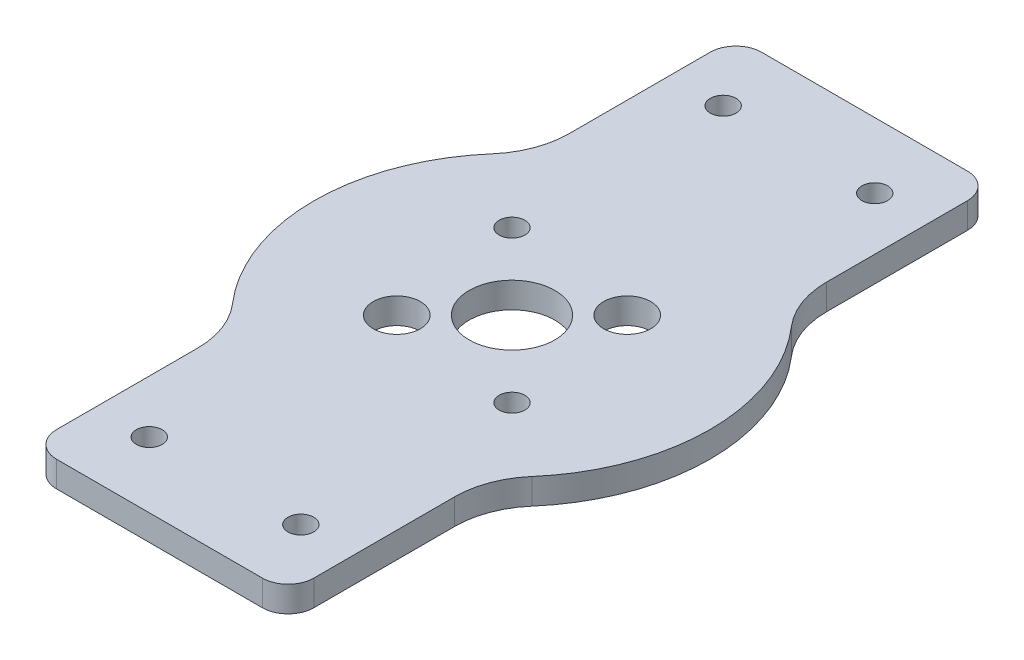
ISO-10303-21;
HEADER;
FILE_DESCRIPTION(('STEP AP214'),'2;1');
FILE_NAME('part.step','',(''),(''),'','','');
FILE_SCHEMA(('AUTOMOTIVE_DESIGN { 1 0 10303 214 1 1 1 1 }'));
ENDSEC;
DATA;
#1=APPLICATION_CONTEXT('core data for automotive mechanical design processes');
#2=APPLICATION_PROTOCOL_DEFINITION('international standard','automotive_design',2000,#1);
#3=PRODUCT_CONTEXT('',#1,'mechanical');
#4=PRODUCT('Part','Part','',(#3));
#5=PRODUCT_RELATED_PRODUCT_CATEGORY('part','',(#4));
#6=PRODUCT_DEFINITION_FORMATION('','',#4);
#7=PRODUCT_DEFINITION_CONTEXT('part definition',#1,'design');
#8=PRODUCT_DEFINITION('design','',#6,#7);
#9=PRODUCT_DEFINITION_SHAPE('','',#8);
#10=(LENGTH_UNIT() NAMED_UNIT(*) SI_UNIT(.MILLI.,.METRE.));
#11=(NAMED_UNIT(*) PLANE_ANGLE_UNIT() SI_UNIT($,.RADIAN.));
#12=(NAMED_UNIT(*) SI_UNIT($,.STERADIAN.) SOLID_ANGLE_UNIT());
#13=UNCERTAINTY_MEASURE_WITH_UNIT(LENGTH_MEASURE(1.E-05),#10,'distance_accuracy_value','');
#14=(GEOMETRIC_REPRESENTATION_CONTEXT(3) GLOBAL_UNCERTAINTY_ASSIGNED_CONTEXT((#13)) GLOBAL_UNIT_ASSIGNED_CONTEXT((#10,
#11,#12)) REPRESENTATION_CONTEXT('',''));
#15=CARTESIAN_POINT('',(0.,0.,0.));
#16=DIRECTION('',(0.,0.,1.));
#17=DIRECTION('',(1.,0.,0.));
#18=AXIS2_PLACEMENT_3D('',#15,#16,#17);
#19=CARTESIAN_POINT('',(25.,3.,21.6935474277491));
#20=DIRECTION('',(0.,-1.,0.));
#21=DIRECTION('',(0.,0.,-1.));
#22=AXIS2_PLACEMENT_3D('',#19,#20,#21);
#23=PLANE('',#22);
#24=CARTESIAN_POINT('',(25.,3.,21.6935474277491));
#25=DIRECTION('',(0.,-1.,0.));
#26=DIRECTION('',(0.,0.,-1.));
#27=AXIS2_PLACEMENT_3D('',#24,#25,#26);
#28=CIRCLE('',#27,10.);
#29=CARTESIAN_POINT('',(15.,3.,21.6935474277491));
#30=VERTEX_POINT('',#29);
#31=CARTESIAN_POINT('',(17.4471299093656,3.,15.1396056066769));
#32=VERTEX_POINT('',#31);
#33=EDGE_CURVE('E209',#30,#32,#28,.T.);
#34=ORIENTED_EDGE('',*,*,#33,.T.);
#35=CARTESIAN_POINT('',(0.,3.,0.));
#36=DIRECTION('',(0.,1.,0.));
#37=DIRECTION('',(0.,0.,-1.));
#38=AXIS2_PLACEMENT_3D('',#35,#36,#37);
#39=CIRCLE('',#38,23.1);
#40=CARTESIAN_POINT('',(17.4471299093656,3.,-15.1396056066769));
#41=VERTEX_POINT('',#40);
#42=EDGE_CURVE('E117',#32,#41,#39,.T.);
#43=ORIENTED_EDGE('',*,*,#42,.T.);
#44=CARTESIAN_POINT('',(25.,3.,-21.6935474277491));
#45=DIRECTION('',(0.,-1.,0.));
#46=DIRECTION('',(0.,0.,1.));
#47=AXIS2_PLACEMENT_3D('',#44,#45,#46);
#48=CIRCLE('',#47,10.);
#49=CARTESIAN_POINT('',(15.,3.,-21.6935474277491));
#50=VERTEX_POINT('',#49);
#51=EDGE_CURVE('E248',#41,#50,#48,.T.);
#52=ORIENTED_EDGE('',*,*,#51,.T.);
#53=DIRECTION('',(0.,0.,-1.));
#54=VECTOR('',#53,1.);
#55=CARTESIAN_POINT('',(15.,3.,-38.1080164681499));
#56=LINE('',#55,#54);
#57=CARTESIAN_POINT('',(15.,3.,-38.1080164681499));
#58=VERTEX_POINT('',#57);
#59=EDGE_CURVE('E267',#50,#58,#56,.T.);
#60=ORIENTED_EDGE('',*,*,#59,.T.);
#61=CARTESIAN_POINT('',(12.,3.,-38.10801646815));
#62=DIRECTION('',(0.,1.,0.));
#63=DIRECTION('',(0.,0.,-1.));
#64=AXIS2_PLACEMENT_3D('',#61,#62,#63);
#65=CIRCLE('',#64,3.);
#66=CARTESIAN_POINT('',(12.,3.,-41.10801646815));
#67=VERTEX_POINT('',#66);
#68=EDGE_CURVE('E264',#58,#67,#65,.T.);
#69=ORIENTED_EDGE('',*,*,#68,.T.);
#70=DIRECTION('',(-1.,0.,0.));
#71=VECTOR('',#70,1.);
#72=CARTESIAN_POINT('',(-12.,3.,-41.10801646815));
#73=LINE('',#72,#71);
#74=CARTESIAN_POINT('',(-12.,3.,-41.10801646815));
#75=VERTEX_POINT('',#74);
#76=EDGE_CURVE('E266',#67,#75,#73,.T.);
#77=ORIENTED_EDGE('',*,*,#76,.T.);
#78=CARTESIAN_POINT('',(-12.,3.,-38.10801646815));
#79=DIRECTION('',(0.,1.,0.));
#80=DIRECTION('',(0.,0.,-1.));
#81=AXIS2_PLACEMENT_3D('',#78,#79,#80);
#82=CIRCLE('',#81,3.);
#83=CARTESIAN_POINT('',(-15.,3.,-38.1080164681499));
#84=VERTEX_POINT('',#83);
#85=EDGE_CURVE('E269',#75,#84,#82,.T.);
#86=ORIENTED_EDGE('',*,*,#85,.T.);
#87=DIRECTION('',(0.,0.,1.));
#88=VECTOR('',#87,1.);
#89=CARTESIAN_POINT('',(-15.,3.,-21.6935474277491));
#90=LINE('',#89,#88);
#91=CARTESIAN_POINT('',(-15.,3.,-21.6935474277491));
#92=VERTEX_POINT('',#91);
#93=EDGE_CURVE('E275',#84,#92,#90,.T.);
#94=ORIENTED_EDGE('',*,*,#93,.T.);
#95=CARTESIAN_POINT('',(-25.,3.,-21.6935474277491));
#96=DIRECTION('',(0.,-1.,0.));
#97=DIRECTION('',(0.,0.,1.));
#98=AXIS2_PLACEMENT_3D('',#95,#96,#97);
#99=CIRCLE('',#98,10.);
#100=CARTESIAN_POINT('',(-17.4471299093656,3.,-15.1396056066769));
#101=VERTEX_POINT('',#100);
#102=EDGE_CURVE('E277',#92,#101,#99,.T.);
#103=ORIENTED_EDGE('',*,*,#102,.T.);
#104=CARTESIAN_POINT('',(0.,3.,0.));
#105=DIRECTION('',(0.,1.,0.));
#106=DIRECTION('',(0.,0.,1.));
#107=AXIS2_PLACEMENT_3D('',#104,#105,#106);
#108=CIRCLE('',#107,23.1);
#109=CARTESIAN_POINT('',(-17.4471299093656,3.,15.1396056066769));
#110=VERTEX_POINT('',#109);
#111=EDGE_CURVE('E279',#101,#110,#108,.T.);
#112=ORIENTED_EDGE('',*,*,#111,.T.);
#113=CARTESIAN_POINT('',(-25.,3.,21.6935474277491));
#114=DIRECTION('',(0.,-1.,0.));
#115=DIRECTION('',(0.,0.,1.));
#116=AXIS2_PLACEMENT_3D('',#113,#114,#115);
#117=CIRCLE('',#116,10.);
#118=CARTESIAN_POINT('',(-15.,3.,21.6935474277491));
#119=VERTEX_POINT('',#118);
#120=EDGE_CURVE('E281',#110,#119,#117,.T.);
#121=ORIENTED_EDGE('',*,*,#120,.T.);
#122=DIRECTION('',(0.,0.,1.));
#123=VECTOR('',#122,1.);
#124=CARTESIAN_POINT('',(-15.,3.,21.6935474277491));
#125=LINE('',#124,#123);
#126=CARTESIAN_POINT('',(-15.,3.,38.1080164681499));
#127=VERTEX_POINT('',#126);
#128=EDGE_CURVE('E283',#119,#127,#125,.T.);
#129=ORIENTED_EDGE('',*,*,#128,.T.);
#130=CARTESIAN_POINT('',(-12.,3.,38.10801646815));
#131=DIRECTION('',(0.,1.,0.));
#132=DIRECTION('',(0.,0.,1.));
#133=AXIS2_PLACEMENT_3D('',#130,#131,#132);
#134=CIRCLE('',#133,3.);
#135=CARTESIAN_POINT('',(-12.,3.,41.10801646815));
#136=VERTEX_POINT('',#135);
#137=EDGE_CURVE('E160',#127,#136,#134,.T.);
#138=ORIENTED_EDGE('',*,*,#137,.T.);
#139=DIRECTION('',(1.,0.,0.));
#140=VECTOR('',#139,1.);
#141=CARTESIAN_POINT('',(-12.,3.,41.10801646815));
#142=LINE('',#141,#140);
#143=CARTESIAN_POINT('',(12.,3.,41.10801646815));
#144=VERTEX_POINT('',#143);
#145=EDGE_CURVE('E154',#136,#144,#142,.T.);
#146=ORIENTED_EDGE('',*,*,#145,.T.);
#147=CARTESIAN_POINT('',(12.,3.,38.10801646815));
#148=DIRECTION('',(0.,1.,0.));
#149=DIRECTION('',(0.,0.,1.));
#150=AXIS2_PLACEMENT_3D('',#147,#148,#149);
#151=CIRCLE('',#150,3.);
#152=CARTESIAN_POINT('',(15.,3.,38.1080164681499));
#153=VERTEX_POINT('',#152);
#154=EDGE_CURVE('E158',#144,#153,#151,.T.);
#155=ORIENTED_EDGE('',*,*,#154,.T.);
#156=DIRECTION('',(0.,0.,-1.));
#157=VECTOR('',#156,1.);
#158=CARTESIAN_POINT('',(15.,3.,38.1080164681499));
#159=LINE('',#158,#157);
#160=EDGE_CURVE('E50',#153,#30,#159,.T.);
#161=ORIENTED_EDGE('',*,*,#160,.T.);
#162=EDGE_LOOP('',(#34,#43,#52,#60,#69,#77,#86,#94,#103,#112,#121,#129,#138,#146,#155,#161));
#163=FACE_BOUND('',#162,.T.);
#164=CARTESIAN_POINT('',(-8.83883476483185,3.,-8.83883476483185));
#165=DIRECTION('',(0.,1.,0.));
#166=DIRECTION('',(0.,0.,1.));
#167=AXIS2_PLACEMENT_3D('',#164,#165,#166);
#168=CIRCLE('',#167,1.5);
#169=CARTESIAN_POINT('',(-8.83883476483185,3.,-7.33883476483185));
#170=VERTEX_POINT('',#169);
#171=EDGE_CURVE('E182',#170,#170,#168,.T.);
#172=ORIENTED_EDGE('',*,*,#171,.F.);
#173=EDGE_LOOP('',(#172));
#174=FACE_BOUND('',#173,.T.);
#175=CARTESIAN_POINT('',(8.83883476483185,3.,8.83883476483184));
#176=DIRECTION('',(0.,1.,0.));
#177=DIRECTION('',(0.,0.,-1.));
#178=AXIS2_PLACEMENT_3D('',#175,#176,#177);
#179=CIRCLE('',#178,1.5);
#180=CARTESIAN_POINT('',(8.83883476483185,3.,7.33883476483184));
#181=VERTEX_POINT('',#180);
#182=EDGE_CURVE('E397',#181,#181,#179,.T.);
#183=ORIENTED_EDGE('',*,*,#182,.F.);
#184=EDGE_LOOP('',(#183));
#185=FACE_BOUND('',#184,.T.);
#186=CARTESIAN_POINT('',(6.7175144212722,3.,-6.7175144212722));
#187=DIRECTION('',(0.,1.,0.));
#188=DIRECTION('',(0.,0.,1.));
#189=AXIS2_PLACEMENT_3D('',#186,#187,#188);
#190=CIRCLE('',#189,2.75);
#191=CARTESIAN_POINT('',(6.7175144212722,3.,-3.9675144212722));
#192=VERTEX_POINT('',#191);
#193=EDGE_CURVE('E391',#192,#192,#190,.T.);
#194=ORIENTED_EDGE('',*,*,#193,.F.);
#195=EDGE_LOOP('',(#194));
#196=FACE_BOUND('',#195,.T.);
#197=CARTESIAN_POINT('',(-6.7175144212722,3.,6.71751442127221));
#198=DIRECTION('',(0.,1.,0.));
#199=DIRECTION('',(0.,0.,-1.));
#200=AXIS2_PLACEMENT_3D('',#197,#198,#199);
#201=CIRCLE('',#200,2.75);
#202=CARTESIAN_POINT('',(-6.7175144212722,3.,3.96751442127221));
#203=VERTEX_POINT('',#202);
#204=EDGE_CURVE('E385',#203,#203,#201,.T.);
#205=ORIENTED_EDGE('',*,*,#204,.F.);
#206=EDGE_LOOP('',(#205));
#207=FACE_BOUND('',#206,.T.);
#208=CARTESIAN_POINT('',(0.,3.,0.));
#209=DIRECTION('',(0.,1.,0.));
#210=DIRECTION('',(0.,0.,1.));
#211=AXIS2_PLACEMENT_3D('',#208,#209,#210);
#212=CIRCLE('',#211,5.);
#213=CARTESIAN_POINT('',(0.,3.,5.));
#214=VERTEX_POINT('',#213);
#215=EDGE_CURVE('E379',#214,#214,#212,.T.);
#216=ORIENTED_EDGE('',*,*,#215,.F.);
#217=EDGE_LOOP('',(#216));
#218=FACE_BOUND('',#217,.T.);
#219=CARTESIAN_POINT('',(-8.83883476483185,3.,-33.4627924380176));
#220=DIRECTION('',(0.,1.,0.));
#221=DIRECTION('',(0.,0.,1.));
#222=AXIS2_PLACEMENT_3D('',#219,#220,#221);
#223=CIRCLE('',#222,1.5);
#224=CARTESIAN_POINT('',(-8.83883476483185,3.,-31.9627924380176));
#225=VERTEX_POINT('',#224);
#226=EDGE_CURVE('E373',#225,#225,#223,.T.);
#227=ORIENTED_EDGE('',*,*,#226,.F.);
#228=EDGE_LOOP('',(#227));
#229=FACE_BOUND('',#228,.T.);
#230=CARTESIAN_POINT('',(8.83883476483185,3.,-33.4627924380176));
#231=DIRECTION('',(0.,1.,0.));
#232=DIRECTION('',(0.,0.,-1.));
#233=AXIS2_PLACEMENT_3D('',#230,#231,#232);
#234=CIRCLE('',#233,1.5);
#235=CARTESIAN_POINT('',(8.83883476483185,3.,-34.9627924380176));
#236=VERTEX_POINT('',#235);
#237=EDGE_CURVE('E367',#236,#236,#234,.T.);
#238=ORIENTED_EDGE('',*,*,#237,.F.);
#239=EDGE_LOOP('',(#238));
#240=FACE_BOUND('',#239,.T.);
#241=CARTESIAN_POINT('',(8.83883476483185,3.,33.4627924380176));
#242=DIRECTION('',(0.,1.,0.));
#243=DIRECTION('',(0.,0.,1.));
#244=AXIS2_PLACEMENT_3D('',#241,#242,#243);
#245=CIRCLE('',#244,1.5);
#246=CARTESIAN_POINT('',(8.83883476483185,3.,34.9627924380176));
#247=VERTEX_POINT('',#246);
#248=EDGE_CURVE('E361',#247,#247,#245,.T.);
#249=ORIENTED_EDGE('',*,*,#248,.F.);
#250=EDGE_LOOP('',(#249));
#251=FACE_BOUND('',#250,.T.);
#252=CARTESIAN_POINT('',(-8.83883476483185,3.,33.4627924380176));
#253=DIRECTION('',(0.,1.,0.));
#254=DIRECTION('',(0.,0.,-1.));
#255=AXIS2_PLACEMENT_3D('',#252,#253,#254);
#256=CIRCLE('',#255,1.5);
#257=CARTESIAN_POINT('',(-8.83883476483185,3.,31.9627924380176));
#258=VERTEX_POINT('',#257);
#259=EDGE_CURVE('E352',#258,#258,#256,.T.);
#260=ORIENTED_EDGE('',*,*,#259,.F.);
#261=EDGE_LOOP('',(#260));
#262=FACE_BOUND('',#261,.T.);
#263=ADVANCED_FACE('F33',(#163,#174,#185,#196,#207,#218,#229,#240,#251,#262),#23,.F.);
#264=CARTESIAN_POINT('',(25.,0.,21.6935474277491));
#265=DIRECTION('',(0.,-1.,0.));
#266=DIRECTION('',(0.,0.,-1.));
#267=AXIS2_PLACEMENT_3D('',#264,#265,#266);
#268=PLANE('',#267);
#269=CARTESIAN_POINT('',(8.83883476483185,0.,33.4627924380176));
#270=DIRECTION('',(0.,1.,0.));
#271=DIRECTION('',(0.,0.,1.));
#272=AXIS2_PLACEMENT_3D('',#269,#270,#271);
#273=CIRCLE('',#272,1.5);
#274=CARTESIAN_POINT('',(8.83883476483185,0.,34.9627924380176));
#275=VERTEX_POINT('',#274);
#276=EDGE_CURVE('E358',#275,#275,#273,.T.);
#277=ORIENTED_EDGE('',*,*,#276,.T.);
#278=EDGE_LOOP('',(#277));
#279=FACE_BOUND('',#278,.T.);
#280=CARTESIAN_POINT('',(-8.83883476483185,0.,-33.4627924380176));
#281=DIRECTION('',(0.,1.,0.));
#282=DIRECTION('',(0.,0.,1.));
#283=AXIS2_PLACEMENT_3D('',#280,#281,#282);
#284=CIRCLE('',#283,1.5);
#285=CARTESIAN_POINT('',(-8.83883476483185,0.,-31.9627924380176));
#286=VERTEX_POINT('',#285);
#287=EDGE_CURVE('E370',#286,#286,#284,.T.);
#288=ORIENTED_EDGE('',*,*,#287,.T.);
#289=EDGE_LOOP('',(#288));
#290=FACE_BOUND('',#289,.T.);
#291=CARTESIAN_POINT('',(-6.7175144212722,0.,6.71751442127221));
#292=DIRECTION('',(0.,1.,0.));
#293=DIRECTION('',(0.,0.,-1.));
#294=AXIS2_PLACEMENT_3D('',#291,#292,#293);
#295=CIRCLE('',#294,2.75);
#296=CARTESIAN_POINT('',(-6.7175144212722,0.,3.96751442127221));
#297=VERTEX_POINT('',#296);
#298=EDGE_CURVE('E382',#297,#297,#295,.T.);
#299=ORIENTED_EDGE('',*,*,#298,.T.);
#300=EDGE_LOOP('',(#299));
#301=FACE_BOUND('',#300,.T.);
#302=CARTESIAN_POINT('',(8.83883476483185,0.,8.83883476483184));
#303=DIRECTION('',(0.,1.,0.));
#304=DIRECTION('',(0.,0.,-1.));
#305=AXIS2_PLACEMENT_3D('',#302,#303,#304);
#306=CIRCLE('',#305,1.5);
#307=CARTESIAN_POINT('',(8.83883476483185,0.,7.33883476483184));
#308=VERTEX_POINT('',#307);
#309=EDGE_CURVE('E394',#308,#308,#306,.T.);
#310=ORIENTED_EDGE('',*,*,#309,.T.);
#311=EDGE_LOOP('',(#310));
#312=FACE_BOUND('',#311,.T.);
#313=CARTESIAN_POINT('',(25.,0.,21.6935474277491));
#314=DIRECTION('',(0.,-1.,0.));
#315=DIRECTION('',(0.,0.,-1.));
#316=AXIS2_PLACEMENT_3D('',#313,#314,#315);
#317=CIRCLE('',#316,10.);
#318=CARTESIAN_POINT('',(15.,0.,21.6935474277491));
#319=VERTEX_POINT('',#318);
#320=CARTESIAN_POINT('',(17.4471299093656,0.,15.1396056066769));
#321=VERTEX_POINT('',#320);
#322=EDGE_CURVE('E178',#319,#321,#317,.T.);
#323=ORIENTED_EDGE('',*,*,#322,.F.);
#324=DIRECTION('',(0.,0.,-1.));
#325=VECTOR('',#324,1.);
#326=CARTESIAN_POINT('',(15.,0.,38.1080164681499));
#327=LINE('',#326,#325);
#328=CARTESIAN_POINT('',(15.,0.,38.1080164681499));
#329=VERTEX_POINT('',#328);
#330=EDGE_CURVE('E109',#329,#319,#327,.T.);
#331=ORIENTED_EDGE('',*,*,#330,.F.);
#332=CARTESIAN_POINT('',(12.,0.,38.10801646815));
#333=DIRECTION('',(0.,1.,0.));
#334=DIRECTION('',(0.,0.,1.));
#335=AXIS2_PLACEMENT_3D('',#332,#333,#334);
#336=CIRCLE('',#335,3.);
#337=CARTESIAN_POINT('',(12.,0.,41.10801646815));
#338=VERTEX_POINT('',#337);
#339=EDGE_CURVE('E103',#338,#329,#336,.T.);
#340=ORIENTED_EDGE('',*,*,#339,.F.);
#341=DIRECTION('',(1.,0.,0.));
#342=VECTOR('',#341,1.);
#343=CARTESIAN_POINT('',(-12.,0.,41.10801646815));
#344=LINE('',#343,#342);
#345=CARTESIAN_POINT('',(-12.,0.,41.10801646815));
#346=VERTEX_POINT('',#345);
#347=EDGE_CURVE('E168',#346,#338,#344,.T.);
#348=ORIENTED_EDGE('',*,*,#347,.F.);
#349=CARTESIAN_POINT('',(-12.,0.,38.10801646815));
#350=DIRECTION('',(0.,1.,0.));
#351=DIRECTION('',(0.,0.,1.));
#352=AXIS2_PLACEMENT_3D('',#349,#350,#351);
#353=CIRCLE('',#352,3.);
#354=CARTESIAN_POINT('',(-15.,0.,38.1080164681499));
#355=VERTEX_POINT('',#354);
#356=EDGE_CURVE('E204',#355,#346,#353,.T.);
#357=ORIENTED_EDGE('',*,*,#356,.F.);
#358=DIRECTION('',(0.,0.,1.));
#359=VECTOR('',#358,1.);
#360=CARTESIAN_POINT('',(-15.,0.,21.6935474277491));
#361=LINE('',#360,#359);
#362=CARTESIAN_POINT('',(-15.,0.,21.6935474277491));
#363=VERTEX_POINT('',#362);
#364=EDGE_CURVE('E202',#363,#355,#361,.T.);
#365=ORIENTED_EDGE('',*,*,#364,.F.);
#366=CARTESIAN_POINT('',(-25.,0.,21.6935474277491));
#367=DIRECTION('',(0.,-1.,0.));
#368=DIRECTION('',(0.,0.,1.));
#369=AXIS2_PLACEMENT_3D('',#366,#367,#368);
#370=CIRCLE('',#369,10.);
#371=CARTESIAN_POINT('',(-17.4471299093656,0.,15.1396056066769));
#372=VERTEX_POINT('',#371);
#373=EDGE_CURVE('E200',#372,#363,#370,.T.);
#374=ORIENTED_EDGE('',*,*,#373,.F.);
#375=CARTESIAN_POINT('',(0.,0.,0.));
#376=DIRECTION('',(0.,1.,0.));
#377=DIRECTION('',(0.,0.,1.));
#378=AXIS2_PLACEMENT_3D('',#375,#376,#377);
#379=CIRCLE('',#378,23.1);
#380=CARTESIAN_POINT('',(-17.4471299093656,0.,-15.1396056066769));
#381=VERTEX_POINT('',#380);
#382=EDGE_CURVE('E198',#381,#372,#379,.T.);
#383=ORIENTED_EDGE('',*,*,#382,.F.);
#384=CARTESIAN_POINT('',(-25.,0.,-21.6935474277491));
#385=DIRECTION('',(0.,-1.,0.));
#386=DIRECTION('',(0.,0.,1.));
#387=AXIS2_PLACEMENT_3D('',#384,#385,#386);
#388=CIRCLE('',#387,10.);
#389=CARTESIAN_POINT('',(-15.,0.,-21.6935474277491));
#390=VERTEX_POINT('',#389);
#391=EDGE_CURVE('E196',#390,#381,#388,.T.);
#392=ORIENTED_EDGE('',*,*,#391,.F.);
#393=DIRECTION('',(0.,0.,1.));
#394=VECTOR('',#393,1.);
#395=CARTESIAN_POINT('',(-15.,0.,-21.6935474277491));
#396=LINE('',#395,#394);
#397=CARTESIAN_POINT('',(-15.,0.,-38.1080164681499));
#398=VERTEX_POINT('',#397);
#399=EDGE_CURVE('E194',#398,#390,#396,.T.);
#400=ORIENTED_EDGE('',*,*,#399,.F.);
#401=CARTESIAN_POINT('',(-12.,0.,-38.10801646815));
#402=DIRECTION('',(0.,1.,0.));
#403=DIRECTION('',(0.,0.,-1.));
#404=AXIS2_PLACEMENT_3D('',#401,#402,#403);
#405=CIRCLE('',#404,3.);
#406=CARTESIAN_POINT('',(-12.,0.,-41.10801646815));
#407=VERTEX_POINT('',#406);
#408=EDGE_CURVE('E192',#407,#398,#405,.T.);
#409=ORIENTED_EDGE('',*,*,#408,.F.);
#410=DIRECTION('',(-1.,0.,0.));
#411=VECTOR('',#410,1.);
#412=CARTESIAN_POINT('',(-12.,0.,-41.10801646815));
#413=LINE('',#412,#411);
#414=CARTESIAN_POINT('',(12.,0.,-41.10801646815));
#415=VERTEX_POINT('',#414);
#416=EDGE_CURVE('E190',#415,#407,#413,.T.);
#417=ORIENTED_EDGE('',*,*,#416,.F.);
#418=CARTESIAN_POINT('',(12.,0.,-38.10801646815));
#419=DIRECTION('',(0.,1.,0.));
#420=DIRECTION('',(0.,0.,-1.));
#421=AXIS2_PLACEMENT_3D('',#418,#419,#420);
#422=CIRCLE('',#421,3.);
#423=CARTESIAN_POINT('',(15.,0.,-38.1080164681499));
#424=VERTEX_POINT('',#423);
#425=EDGE_CURVE('E188',#424,#415,#422,.T.);
#426=ORIENTED_EDGE('',*,*,#425,.F.);
#427=DIRECTION('',(0.,0.,-1.));
#428=VECTOR('',#427,1.);
#429=CARTESIAN_POINT('',(15.,0.,-38.1080164681499));
#430=LINE('',#429,#428);
#431=CARTESIAN_POINT('',(15.,0.,-21.6935474277491));
#432=VERTEX_POINT('',#431);
#433=EDGE_CURVE('E186',#432,#424,#430,.T.);
#434=ORIENTED_EDGE('',*,*,#433,.F.);
#435=CARTESIAN_POINT('',(25.,0.,-21.6935474277491));
#436=DIRECTION('',(0.,-1.,0.));
#437=DIRECTION('',(0.,0.,1.));
#438=AXIS2_PLACEMENT_3D('',#435,#436,#437);
#439=CIRCLE('',#438,10.);
#440=CARTESIAN_POINT('',(17.4471299093656,0.,-15.1396056066769));
#441=VERTEX_POINT('',#440);
#442=EDGE_CURVE('E184',#441,#432,#439,.T.);
#443=ORIENTED_EDGE('',*,*,#442,.F.);
#444=CARTESIAN_POINT('',(0.,0.,0.));
#445=DIRECTION('',(0.,1.,0.));
#446=DIRECTION('',(0.,0.,-1.));
#447=AXIS2_PLACEMENT_3D('',#444,#445,#446);
#448=CIRCLE('',#447,23.1);
#449=EDGE_CURVE('E181',#321,#441,#448,.T.);
#450=ORIENTED_EDGE('',*,*,#449,.F.);
#451=EDGE_LOOP('',(#323,#331,#340,#348,#357,#365,#374,#383,#392,#400,#409,#417,#426,#434,#443,#450));
#452=FACE_BOUND('',#451,.T.);
#453=CARTESIAN_POINT('',(-8.83883476483185,0.,-8.83883476483185));
#454=DIRECTION('',(0.,1.,0.));
#455=DIRECTION('',(0.,0.,1.));
#456=AXIS2_PLACEMENT_3D('',#453,#454,#455);
#457=CIRCLE('',#456,1.5);
#458=CARTESIAN_POINT('',(-8.83883476483185,0.,-7.33883476483185));
#459=VERTEX_POINT('',#458);
#460=EDGE_CURVE('E400',#459,#459,#457,.T.);
#461=ORIENTED_EDGE('',*,*,#460,.T.);
#462=EDGE_LOOP('',(#461));
#463=FACE_BOUND('',#462,.T.);
#464=CARTESIAN_POINT('',(6.7175144212722,0.,-6.7175144212722));
#465=DIRECTION('',(0.,1.,0.));
#466=DIRECTION('',(0.,0.,1.));
#467=AXIS2_PLACEMENT_3D('',#464,#465,#466);
#468=CIRCLE('',#467,2.75);
#469=CARTESIAN_POINT('',(6.7175144212722,0.,-3.9675144212722));
#470=VERTEX_POINT('',#469);
#471=EDGE_CURVE('E388',#470,#470,#468,.T.);
#472=ORIENTED_EDGE('',*,*,#471,.T.);
#473=EDGE_LOOP('',(#472));
#474=FACE_BOUND('',#473,.T.);
#475=CARTESIAN_POINT('',(0.,0.,0.));
#476=DIRECTION('',(0.,1.,0.));
#477=DIRECTION('',(0.,0.,1.));
#478=AXIS2_PLACEMENT_3D('',#475,#476,#477);
#479=CIRCLE('',#478,5.);
#480=CARTESIAN_POINT('',(0.,0.,5.));
#481=VERTEX_POINT('',#480);
#482=EDGE_CURVE('E376',#481,#481,#479,.T.);
#483=ORIENTED_EDGE('',*,*,#482,.T.);
#484=EDGE_LOOP('',(#483));
#485=FACE_BOUND('',#484,.T.);
#486=CARTESIAN_POINT('',(8.83883476483185,0.,-33.4627924380176));
#487=DIRECTION('',(0.,1.,0.));
#488=DIRECTION('',(0.,0.,-1.));
#489=AXIS2_PLACEMENT_3D('',#486,#487,#488);
#490=CIRCLE('',#489,1.5);
#491=CARTESIAN_POINT('',(8.83883476483185,0.,-34.9627924380176));
#492=VERTEX_POINT('',#491);
#493=EDGE_CURVE('E364',#492,#492,#490,.T.);
#494=ORIENTED_EDGE('',*,*,#493,.T.);
#495=EDGE_LOOP('',(#494));
#496=FACE_BOUND('',#495,.T.);
#497=CARTESIAN_POINT('',(-8.83883476483185,0.,33.4627924380176));
#498=DIRECTION('',(0.,1.,0.));
#499=DIRECTION('',(0.,0.,-1.));
#500=AXIS2_PLACEMENT_3D('',#497,#498,#499);
#501=CIRCLE('',#500,1.5);
#502=CARTESIAN_POINT('',(-8.83883476483185,0.,31.9627924380176));
#503=VERTEX_POINT('',#502);
#504=EDGE_CURVE('E355',#503,#503,#501,.T.);
#505=ORIENTED_EDGE('',*,*,#504,.T.);
#506=EDGE_LOOP('',(#505));
#507=FACE_BOUND('',#506,.T.);
#508=ADVANCED_FACE('F252',(#279,#290,#301,#312,#452,#463,#474,#485,#496,#507),#268,.T.);
#509=CARTESIAN_POINT('',(25.,3.,21.6935474277491));
#510=DIRECTION('',(0.,-1.,0.));
#511=DIRECTION('',(0.,0.,-1.));
#512=AXIS2_PLACEMENT_3D('',#509,#510,#511);
#513=CYLINDRICAL_SURFACE('',#512,10.);
#514=ORIENTED_EDGE('',*,*,#322,.T.);
#515=DIRECTION('',(0.,-1.,0.));
#516=VECTOR('',#515,1.);
#517=CARTESIAN_POINT('',(17.4471299093656,3.,15.1396056066769));
#518=LINE('',#517,#516);
#519=EDGE_CURVE('E11',#32,#321,#518,.T.);
#520=ORIENTED_EDGE('',*,*,#519,.F.);
#521=ORIENTED_EDGE('',*,*,#33,.F.);
#522=DIRECTION('',(0.,-1.,0.));
#523=VECTOR('',#522,1.);
#524=CARTESIAN_POINT('',(15.,3.,21.6935474277491));
#525=LINE('',#524,#523);
#526=EDGE_CURVE('E174',#30,#319,#525,.T.);
#527=ORIENTED_EDGE('',*,*,#526,.T.);
#528=EDGE_LOOP('',(#514,#520,#521,#527));
#529=FACE_BOUND('',#528,.T.);
#530=ADVANCED_FACE('F35',(#529),#513,.F.);
#531=CARTESIAN_POINT('',(0.,3.,0.));
#532=DIRECTION('',(0.,-1.,0.));
#533=DIRECTION('',(0.,0.,-1.));
#534=AXIS2_PLACEMENT_3D('',#531,#532,#533);
#535=CYLINDRICAL_SURFACE('',#534,23.1);
#536=ORIENTED_EDGE('',*,*,#449,.T.);
#537=DIRECTION('',(0.,-1.,0.));
#538=VECTOR('',#537,1.);
#539=CARTESIAN_POINT('',(17.4471299093656,3.,-15.1396056066769));
#540=LINE('',#539,#538);
#541=EDGE_CURVE('E42',#41,#441,#540,.T.);
#542=ORIENTED_EDGE('',*,*,#541,.F.);
#543=ORIENTED_EDGE('',*,*,#42,.F.);
#544=ORIENTED_EDGE('',*,*,#519,.T.);
#545=EDGE_LOOP('',(#536,#542,#543,#544));
#546=FACE_BOUND('',#545,.T.);
#547=ADVANCED_FACE('F597',(#546),#535,.T.);
#548=CARTESIAN_POINT('',(25.,3.,-21.6935474277491));
#549=DIRECTION('',(0.,-1.,0.));
#550=DIRECTION('',(0.,0.,-1.));
#551=AXIS2_PLACEMENT_3D('',#548,#549,#550);
#552=CYLINDRICAL_SURFACE('',#551,10.);
#553=ORIENTED_EDGE('',*,*,#442,.T.);
#554=DIRECTION('',(0.,-1.,0.));
#555=VECTOR('',#554,1.);
#556=CARTESIAN_POINT('',(15.,3.,-21.6935474277491));
#557=LINE('',#556,#555);
#558=EDGE_CURVE('E240',#50,#432,#557,.T.);
#559=ORIENTED_EDGE('',*,*,#558,.F.);
#560=ORIENTED_EDGE('',*,*,#51,.F.);
#561=ORIENTED_EDGE('',*,*,#541,.T.);
#562=EDGE_LOOP('',(#553,#559,#560,#561));
#563=FACE_BOUND('',#562,.T.);
#564=ADVANCED_FACE('F246',(#563),#552,.F.);
#565=CARTESIAN_POINT('',(15.,3.,-38.1080164681499));
#566=DIRECTION('',(-1.,0.,0.));
#567=DIRECTION('',(0.,0.,1.));
#568=AXIS2_PLACEMENT_3D('',#565,#566,#567);
#569=PLANE('',#568);
#570=ORIENTED_EDGE('',*,*,#433,.T.);
#571=DIRECTION('',(0.,-1.,0.));
#572=VECTOR('',#571,1.);
#573=CARTESIAN_POINT('',(15.,3.,-38.1080164681499));
#574=LINE('',#573,#572);
#575=EDGE_CURVE('E237',#58,#424,#574,.T.);
#576=ORIENTED_EDGE('',*,*,#575,.F.);
#577=ORIENTED_EDGE('',*,*,#59,.F.);
#578=ORIENTED_EDGE('',*,*,#558,.T.);
#579=EDGE_LOOP('',(#570,#576,#577,#578));
#580=FACE_BOUND('',#579,.T.);
#581=ADVANCED_FACE('F258',(#580),#569,.F.);
#582=CARTESIAN_POINT('',(12.,3.,-38.10801646815));
#583=DIRECTION('',(0.,-1.,0.));
#584=DIRECTION('',(0.,0.,-1.));
#585=AXIS2_PLACEMENT_3D('',#582,#583,#584);
#586=CYLINDRICAL_SURFACE('',#585,3.);
#587=ORIENTED_EDGE('',*,*,#425,.T.);
#588=DIRECTION('',(0.,-1.,0.));
#589=VECTOR('',#588,1.);
#590=CARTESIAN_POINT('',(12.,3.,-41.10801646815));
#591=LINE('',#590,#589);
#592=EDGE_CURVE('E234',#67,#415,#591,.T.);
#593=ORIENTED_EDGE('',*,*,#592,.F.);
#594=ORIENTED_EDGE('',*,*,#68,.F.);
#595=ORIENTED_EDGE('',*,*,#575,.T.);
#596=EDGE_LOOP('',(#587,#593,#594,#595));
#597=FACE_BOUND('',#596,.T.);
#598=ADVANCED_FACE('F262',(#597),#586,.T.);
#599=CARTESIAN_POINT('',(-12.,3.,-41.10801646815));
#600=DIRECTION('',(0.,0.,1.));
#601=DIRECTION('',(1.,0.,0.));
#602=AXIS2_PLACEMENT_3D('',#599,#600,#601);
#603=PLANE('',#602);
#604=ORIENTED_EDGE('',*,*,#416,.T.);
#605=DIRECTION('',(0.,-1.,0.));
#606=VECTOR('',#605,1.);
#607=CARTESIAN_POINT('',(-12.,3.,-41.10801646815));
#608=LINE('',#607,#606);
#609=EDGE_CURVE('E231',#75,#407,#608,.T.);
#610=ORIENTED_EDGE('',*,*,#609,.F.);
#611=ORIENTED_EDGE('',*,*,#76,.F.);
#612=ORIENTED_EDGE('',*,*,#592,.T.);
#613=EDGE_LOOP('',(#604,#610,#611,#612));
#614=FACE_BOUND('',#613,.T.);
#615=ADVANCED_FACE('F562',(#614),#603,.F.);
#616=CARTESIAN_POINT('',(-12.,3.,-38.10801646815));
#617=DIRECTION('',(0.,-1.,0.));
#618=DIRECTION('',(0.,0.,-1.));
#619=AXIS2_PLACEMENT_3D('',#616,#617,#618);
#620=CYLINDRICAL_SURFACE('',#619,3.);
#621=ORIENTED_EDGE('',*,*,#408,.T.);
#622=DIRECTION('',(0.,-1.,0.));
#623=VECTOR('',#622,1.);
#624=CARTESIAN_POINT('',(-15.,3.,-38.1080164681499));
#625=LINE('',#624,#623);
#626=EDGE_CURVE('E228',#84,#398,#625,.T.);
#627=ORIENTED_EDGE('',*,*,#626,.F.);
#628=ORIENTED_EDGE('',*,*,#85,.F.);
#629=ORIENTED_EDGE('',*,*,#609,.T.);
#630=EDGE_LOOP('',(#621,#627,#628,#629));
#631=FACE_BOUND('',#630,.T.);
#632=ADVANCED_FACE('F552',(#631),#620,.T.);
#633=CARTESIAN_POINT('',(-15.,3.,-21.6935474277491));
#634=DIRECTION('',(1.,0.,0.));
#635=DIRECTION('',(0.,0.,-1.));
#636=AXIS2_PLACEMENT_3D('',#633,#634,#635);
#637=PLANE('',#636);
#638=ORIENTED_EDGE('',*,*,#399,.T.);
#639=DIRECTION('',(0.,-1.,0.));
#640=VECTOR('',#639,1.);
#641=CARTESIAN_POINT('',(-15.,3.,-21.6935474277491));
#642=LINE('',#641,#640);
#643=EDGE_CURVE('E225',#92,#390,#642,.T.);
#644=ORIENTED_EDGE('',*,*,#643,.F.);
#645=ORIENTED_EDGE('',*,*,#93,.F.);
#646=ORIENTED_EDGE('',*,*,#626,.T.);
#647=EDGE_LOOP('',(#638,#644,#645,#646));
#648=FACE_BOUND('',#647,.T.);
#649=ADVANCED_FACE('F542',(#648),#637,.F.);
#650=CARTESIAN_POINT('',(-25.,3.,-21.6935474277491));
#651=DIRECTION('',(0.,-1.,0.));
#652=DIRECTION('',(0.,0.,-1.));
#653=AXIS2_PLACEMENT_3D('',#650,#651,#652);
#654=CYLINDRICAL_SURFACE('',#653,10.);
#655=ORIENTED_EDGE('',*,*,#391,.T.);
#656=DIRECTION('',(0.,-1.,0.));
#657=VECTOR('',#656,1.);
#658=CARTESIAN_POINT('',(-17.4471299093656,3.,-15.1396056066769));
#659=LINE('',#658,#657);
#660=EDGE_CURVE('E222',#101,#381,#659,.T.);
#661=ORIENTED_EDGE('',*,*,#660,.F.);
#662=ORIENTED_EDGE('',*,*,#102,.F.);
#663=ORIENTED_EDGE('',*,*,#643,.T.);
#664=EDGE_LOOP('',(#655,#661,#662,#663));
#665=FACE_BOUND('',#664,.T.);
#666=ADVANCED_FACE('F532',(#665),#654,.F.);
#667=CARTESIAN_POINT('',(0.,3.,0.));
#668=DIRECTION('',(0.,-1.,0.));
#669=DIRECTION('',(0.,0.,-1.));
#670=AXIS2_PLACEMENT_3D('',#667,#668,#669);
#671=CYLINDRICAL_SURFACE('',#670,23.1);
#672=ORIENTED_EDGE('',*,*,#382,.T.);
#673=DIRECTION('',(0.,-1.,0.));
#674=VECTOR('',#673,1.);
#675=CARTESIAN_POINT('',(-17.4471299093656,3.,15.1396056066769));
#676=LINE('',#675,#674);
#677=EDGE_CURVE('E219',#110,#372,#676,.T.);
#678=ORIENTED_EDGE('',*,*,#677,.F.);
#679=ORIENTED_EDGE('',*,*,#111,.F.);
#680=ORIENTED_EDGE('',*,*,#660,.T.);
#681=EDGE_LOOP('',(#672,#678,#679,#680));
#682=FACE_BOUND('',#681,.T.);
#683=ADVANCED_FACE('F522',(#682),#671,.T.);
#684=CARTESIAN_POINT('',(-25.,3.,21.6935474277491));
#685=DIRECTION('',(0.,-1.,0.));
#686=DIRECTION('',(0.,0.,-1.));
#687=AXIS2_PLACEMENT_3D('',#684,#685,#686);
#688=CYLINDRICAL_SURFACE('',#687,10.);
#689=ORIENTED_EDGE('',*,*,#373,.T.);
#690=DIRECTION('',(0.,-1.,0.));
#691=VECTOR('',#690,1.);
#692=CARTESIAN_POINT('',(-15.,3.,21.6935474277491));
#693=LINE('',#692,#691);
#694=EDGE_CURVE('E216',#119,#363,#693,.T.);
#695=ORIENTED_EDGE('',*,*,#694,.F.);
#696=ORIENTED_EDGE('',*,*,#120,.F.);
#697=ORIENTED_EDGE('',*,*,#677,.T.);
#698=EDGE_LOOP('',(#689,#695,#696,#697));
#699=FACE_BOUND('',#698,.T.);
#700=ADVANCED_FACE('F513',(#699),#688,.F.);
#701=CARTESIAN_POINT('',(-15.,3.,21.6935474277491));
#702=DIRECTION('',(1.,0.,0.));
#703=DIRECTION('',(0.,0.,-1.));
#704=AXIS2_PLACEMENT_3D('',#701,#702,#703);
#705=PLANE('',#704);
#706=ORIENTED_EDGE('',*,*,#364,.T.);
#707=DIRECTION('',(0.,-1.,0.));
#708=VECTOR('',#707,1.);
#709=CARTESIAN_POINT('',(-15.,3.,38.1080164681499));
#710=LINE('',#709,#708);
#711=EDGE_CURVE('E213',#127,#355,#710,.T.);
#712=ORIENTED_EDGE('',*,*,#711,.F.);
#713=ORIENTED_EDGE('',*,*,#128,.F.);
#714=ORIENTED_EDGE('',*,*,#694,.T.);
#715=EDGE_LOOP('',(#706,#712,#713,#714));
#716=FACE_BOUND('',#715,.T.);
#717=ADVANCED_FACE('F289',(#716),#705,.F.);
#718=CARTESIAN_POINT('',(-12.,3.,38.10801646815));
#719=DIRECTION('',(0.,-1.,0.));
#720=DIRECTION('',(0.,0.,-1.));
#721=AXIS2_PLACEMENT_3D('',#718,#719,#720);
#722=CYLINDRICAL_SURFACE('',#721,3.);
#723=ORIENTED_EDGE('',*,*,#356,.T.);
#724=DIRECTION('',(0.,-1.,0.));
#725=VECTOR('',#724,1.);
#726=CARTESIAN_POINT('',(-12.,3.,41.10801646815));
#727=LINE('',#726,#725);
#728=EDGE_CURVE('E169',#136,#346,#727,.T.);
#729=ORIENTED_EDGE('',*,*,#728,.F.);
#730=ORIENTED_EDGE('',*,*,#137,.F.);
#731=ORIENTED_EDGE('',*,*,#711,.T.);
#732=EDGE_LOOP('',(#723,#729,#730,#731));
#733=FACE_BOUND('',#732,.T.);
#734=ADVANCED_FACE('F293',(#733),#722,.T.);
#735=CARTESIAN_POINT('',(-12.,3.,41.10801646815));
#736=DIRECTION('',(0.,0.,-1.));
#737=DIRECTION('',(-1.,0.,0.));
#738=AXIS2_PLACEMENT_3D('',#735,#736,#737);
#739=PLANE('',#738);
#740=ORIENTED_EDGE('',*,*,#347,.T.);
#741=DIRECTION('',(0.,-1.,0.));
#742=VECTOR('',#741,1.);
#743=CARTESIAN_POINT('',(12.,3.,41.10801646815));
#744=LINE('',#743,#742);
#745=EDGE_CURVE('E165',#144,#338,#744,.T.);
#746=ORIENTED_EDGE('',*,*,#745,.F.);
#747=ORIENTED_EDGE('',*,*,#145,.F.);
#748=ORIENTED_EDGE('',*,*,#728,.T.);
#749=EDGE_LOOP('',(#740,#746,#747,#748));
#750=FACE_BOUND('',#749,.T.);
#751=ADVANCED_FACE('F166',(#750),#739,.F.);
#752=CARTESIAN_POINT('',(12.,3.,38.10801646815));
#753=DIRECTION('',(0.,-1.,0.));
#754=DIRECTION('',(0.,0.,-1.));
#755=AXIS2_PLACEMENT_3D('',#752,#753,#754);
#756=CYLINDRICAL_SURFACE('',#755,3.);
#757=ORIENTED_EDGE('',*,*,#339,.T.);
#758=DIRECTION('',(0.,-1.,0.));
#759=VECTOR('',#758,1.);
#760=CARTESIAN_POINT('',(15.,3.,38.1080164681499));
#761=LINE('',#760,#759);
#762=EDGE_CURVE('E170',#153,#329,#761,.T.);
#763=ORIENTED_EDGE('',*,*,#762,.F.);
#764=ORIENTED_EDGE('',*,*,#154,.F.);
#765=ORIENTED_EDGE('',*,*,#745,.T.);
#766=EDGE_LOOP('',(#757,#763,#764,#765));
#767=FACE_BOUND('',#766,.T.);
#768=ADVANCED_FACE('F172',(#767),#756,.T.);
#769=CARTESIAN_POINT('',(15.,3.,38.1080164681499));
#770=DIRECTION('',(-1.,0.,0.));
#771=DIRECTION('',(0.,0.,1.));
#772=AXIS2_PLACEMENT_3D('',#769,#770,#771);
#773=PLANE('',#772);
#774=ORIENTED_EDGE('',*,*,#330,.T.);
#775=ORIENTED_EDGE('',*,*,#526,.F.);
#776=ORIENTED_EDGE('',*,*,#160,.F.);
#777=ORIENTED_EDGE('',*,*,#762,.T.);
#778=EDGE_LOOP('',(#774,#775,#776,#777));
#779=FACE_BOUND('',#778,.T.);
#780=ADVANCED_FACE('F297',(#779),#773,.F.);
#781=CARTESIAN_POINT('',(-8.83883476483185,3.,-8.83883476483185));
#782=DIRECTION('',(0.,-1.,0.));
#783=DIRECTION('',(0.,0.,-1.));
#784=AXIS2_PLACEMENT_3D('',#781,#782,#783);
#785=CYLINDRICAL_SURFACE('',#784,1.5);
#786=ORIENTED_EDGE('',*,*,#171,.T.);
#787=EDGE_LOOP('',(#786));
#788=FACE_BOUND('',#787,.T.);
#789=ORIENTED_EDGE('',*,*,#460,.F.);
#790=EDGE_LOOP('',(#789));
#791=FACE_BOUND('',#790,.T.);
#792=ADVANCED_FACE('F299',(#788,#791),#785,.F.);
#793=CARTESIAN_POINT('',(8.83883476483185,3.,8.83883476483184));
#794=DIRECTION('',(0.,-1.,0.));
#795=DIRECTION('',(0.,0.,-1.));
#796=AXIS2_PLACEMENT_3D('',#793,#794,#795);
#797=CYLINDRICAL_SURFACE('',#796,1.5);
#798=ORIENTED_EDGE('',*,*,#182,.T.);
#799=EDGE_LOOP('',(#798));
#800=FACE_BOUND('',#799,.T.);
#801=ORIENTED_EDGE('',*,*,#309,.F.);
#802=EDGE_LOOP('',(#801));
#803=FACE_BOUND('',#802,.T.);
#804=ADVANCED_FACE('F305',(#800,#803),#797,.F.);
#805=CARTESIAN_POINT('',(6.7175144212722,3.,-6.7175144212722));
#806=DIRECTION('',(0.,-1.,0.));
#807=DIRECTION('',(0.,0.,-1.));
#808=AXIS2_PLACEMENT_3D('',#805,#806,#807);
#809=CYLINDRICAL_SURFACE('',#808,2.75);
#810=ORIENTED_EDGE('',*,*,#193,.T.);
#811=EDGE_LOOP('',(#810));
#812=FACE_BOUND('',#811,.T.);
#813=ORIENTED_EDGE('',*,*,#471,.F.);
#814=EDGE_LOOP('',(#813));
#815=FACE_BOUND('',#814,.T.);
#816=ADVANCED_FACE('F319',(#812,#815),#809,.F.);
#817=CARTESIAN_POINT('',(-6.7175144212722,3.,6.71751442127221));
#818=DIRECTION('',(0.,-1.,0.));
#819=DIRECTION('',(0.,0.,-1.));
#820=AXIS2_PLACEMENT_3D('',#817,#818,#819);
#821=CYLINDRICAL_SURFACE('',#820,2.75);
#822=ORIENTED_EDGE('',*,*,#204,.T.);
#823=EDGE_LOOP('',(#822));
#824=FACE_BOUND('',#823,.T.);
#825=ORIENTED_EDGE('',*,*,#298,.F.);
#826=EDGE_LOOP('',(#825));
#827=FACE_BOUND('',#826,.T.);
#828=ADVANCED_FACE('F323',(#824,#827),#821,.F.);
#829=CARTESIAN_POINT('',(0.,3.,0.));
#830=DIRECTION('',(0.,-1.,0.));
#831=DIRECTION('',(0.,0.,-1.));
#832=AXIS2_PLACEMENT_3D('',#829,#830,#831);
#833=CYLINDRICAL_SURFACE('',#832,5.);
#834=ORIENTED_EDGE('',*,*,#215,.T.);
#835=EDGE_LOOP('',(#834));
#836=FACE_BOUND('',#835,.T.);
#837=ORIENTED_EDGE('',*,*,#482,.F.);
#838=EDGE_LOOP('',(#837));
#839=FACE_BOUND('',#838,.T.);
#840=ADVANCED_FACE('F327',(#836,#839),#833,.F.);
#841=CARTESIAN_POINT('',(-8.83883476483185,3.,-33.4627924380176));
#842=DIRECTION('',(0.,-1.,0.));
#843=DIRECTION('',(0.,0.,-1.));
#844=AXIS2_PLACEMENT_3D('',#841,#842,#843);
#845=CYLINDRICAL_SURFACE('',#844,1.5);
#846=ORIENTED_EDGE('',*,*,#226,.T.);
#847=EDGE_LOOP('',(#846));
#848=FACE_BOUND('',#847,.T.);
#849=ORIENTED_EDGE('',*,*,#287,.F.);
#850=EDGE_LOOP('',(#849));
#851=FACE_BOUND('',#850,.T.);
#852=ADVANCED_FACE('F331',(#848,#851),#845,.F.);
#853=CARTESIAN_POINT('',(8.83883476483185,3.,-33.4627924380176));
#854=DIRECTION('',(0.,-1.,0.));
#855=DIRECTION('',(0.,0.,-1.));
#856=AXIS2_PLACEMENT_3D('',#853,#854,#855);
#857=CYLINDRICAL_SURFACE('',#856,1.5);
#858=ORIENTED_EDGE('',*,*,#237,.T.);
#859=EDGE_LOOP('',(#858));
#860=FACE_BOUND('',#859,.T.);
#861=ORIENTED_EDGE('',*,*,#493,.F.);
#862=EDGE_LOOP('',(#861));
#863=FACE_BOUND('',#862,.T.);
#864=ADVANCED_FACE('F335',(#860,#863),#857,.F.);
#865=CARTESIAN_POINT('',(8.83883476483185,3.,33.4627924380176));
#866=DIRECTION('',(0.,-1.,0.));
#867=DIRECTION('',(0.,0.,-1.));
#868=AXIS2_PLACEMENT_3D('',#865,#866,#867);
#869=CYLINDRICAL_SURFACE('',#868,1.5);
#870=ORIENTED_EDGE('',*,*,#248,.T.);
#871=EDGE_LOOP('',(#870));
#872=FACE_BOUND('',#871,.T.);
#873=ORIENTED_EDGE('',*,*,#276,.F.);
#874=EDGE_LOOP('',(#873));
#875=FACE_BOUND('',#874,.T.);
#876=ADVANCED_FACE('F339',(#872,#875),#869,.F.);
#877=CARTESIAN_POINT('',(-8.83883476483185,3.,33.4627924380176));
#878=DIRECTION('',(0.,-1.,0.));
#879=DIRECTION('',(0.,0.,-1.));
#880=AXIS2_PLACEMENT_3D('',#877,#878,#879);
#881=CYLINDRICAL_SURFACE('',#880,1.5);
#882=ORIENTED_EDGE('',*,*,#259,.T.);
#883=EDGE_LOOP('',(#882));
#884=FACE_BOUND('',#883,.T.);
#885=ORIENTED_EDGE('',*,*,#504,.F.);
#886=EDGE_LOOP('',(#885));
#887=FACE_BOUND('',#886,.T.);
#888=ADVANCED_FACE('F343',(#884,#887),#881,.F.);
#889=CLOSED_SHELL('',(#263,#508,#530,#547,#564,#581,#598,#615,#632,#649,#666,#683,#700,#717,
#734,#751,#768,#780,#792,#804,#816,#828,#840,#852,#864,#876,#888));
#890=MANIFOLD_SOLID_BREP('B2',#889);
#891=ADVANCED_BREP_SHAPE_REPRESENTATION('',(#18,#890),#14);
#892=SHAPE_DEFINITION_REPRESENTATION(#9,#891);
ENDSEC;
END-ISO-10303-21;
